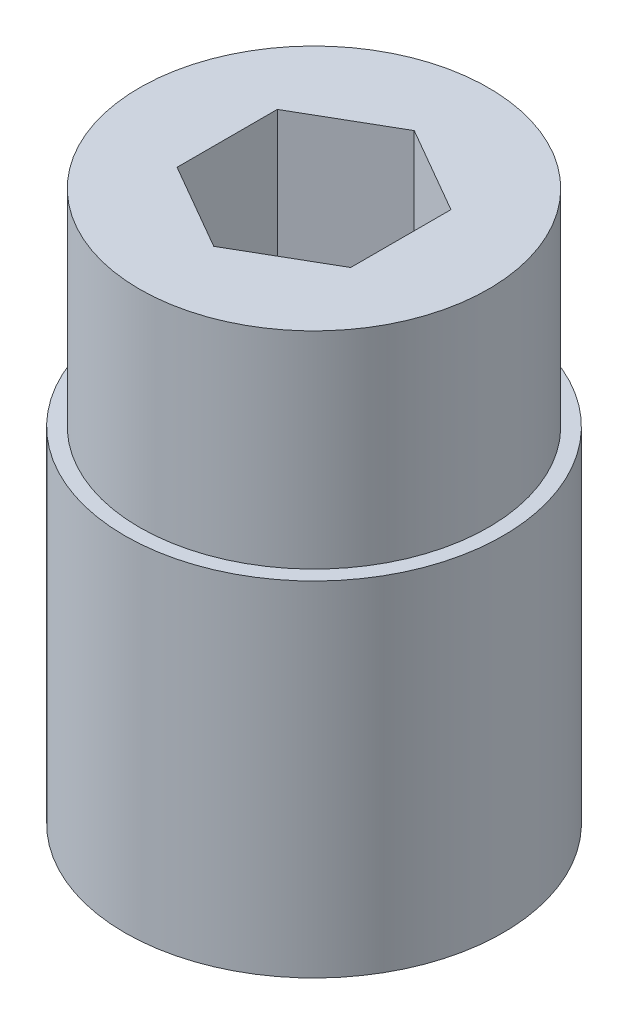
ISO-10303-21;
HEADER;
FILE_DESCRIPTION(('STEP AP214'),'2;1');
FILE_NAME('part.step','',(''),(''),'','','');
FILE_SCHEMA(('AUTOMOTIVE_DESIGN { 1 0 10303 214 1 1 1 1 }'));
ENDSEC;
DATA;
#1=APPLICATION_CONTEXT('core data for automotive mechanical design processes');
#2=APPLICATION_PROTOCOL_DEFINITION('international standard','automotive_design',2000,#1);
#3=PRODUCT_CONTEXT('',#1,'mechanical');
#4=PRODUCT('Part','Part','',(#3));
#5=PRODUCT_RELATED_PRODUCT_CATEGORY('part','',(#4));
#6=PRODUCT_DEFINITION_FORMATION('','',#4);
#7=PRODUCT_DEFINITION_CONTEXT('part definition',#1,'design');
#8=PRODUCT_DEFINITION('design','',#6,#7);
#9=PRODUCT_DEFINITION_SHAPE('','',#8);
#10=(LENGTH_UNIT() NAMED_UNIT(*) SI_UNIT(.MILLI.,.METRE.));
#11=(NAMED_UNIT(*) PLANE_ANGLE_UNIT() SI_UNIT($,.RADIAN.));
#12=(NAMED_UNIT(*) SI_UNIT($,.STERADIAN.) SOLID_ANGLE_UNIT());
#13=UNCERTAINTY_MEASURE_WITH_UNIT(LENGTH_MEASURE(1.E-05),#10,'distance_accuracy_value','');
#14=(GEOMETRIC_REPRESENTATION_CONTEXT(3) GLOBAL_UNCERTAINTY_ASSIGNED_CONTEXT((#13)) GLOBAL_UNIT_ASSIGNED_CONTEXT((#10,
#11,#12)) REPRESENTATION_CONTEXT('',''));
#15=CARTESIAN_POINT('',(0.,0.,0.));
#16=DIRECTION('',(0.,0.,1.));
#17=DIRECTION('',(1.,0.,0.));
#18=AXIS2_PLACEMENT_3D('',#15,#16,#17);
#19=CARTESIAN_POINT('',(0.,10.,0.));
#20=DIRECTION('',(0.,1.,0.));
#21=DIRECTION('',(0.,0.,1.));
#22=AXIS2_PLACEMENT_3D('',#19,#20,#21);
#23=PLANE('',#22);
#24=CARTESIAN_POINT('',(0.,10.,0.));
#25=DIRECTION('',(0.,1.,0.));
#26=DIRECTION('',(0.,0.,1.));
#27=AXIS2_PLACEMENT_3D('',#24,#25,#26);
#28=CIRCLE('',#27,5.075);
#29=CARTESIAN_POINT('',(0.,10.,5.075));
#30=VERTEX_POINT('',#29);
#31=EDGE_CURVE('E12',#30,#30,#28,.T.);
#32=ORIENTED_EDGE('',*,*,#31,.F.);
#33=EDGE_LOOP('',(#32));
#34=FACE_BOUND('',#33,.T.);
#35=CARTESIAN_POINT('',(0.,10.,0.));
#36=DIRECTION('',(0.,1.,0.));
#37=DIRECTION('',(0.,0.,1.));
#38=AXIS2_PLACEMENT_3D('',#35,#36,#37);
#39=CIRCLE('',#38,5.5);
#40=CARTESIAN_POINT('',(0.,10.,5.5));
#41=VERTEX_POINT('',#40);
#42=EDGE_CURVE('E117',#41,#41,#39,.T.);
#43=ORIENTED_EDGE('',*,*,#42,.T.);
#44=EDGE_LOOP('',(#43));
#45=FACE_BOUND('',#44,.T.);
#46=ADVANCED_FACE('F40',(#34,#45),#23,.T.);
#47=CARTESIAN_POINT('',(0.,0.,0.));
#48=DIRECTION('',(0.,1.,0.));
#49=DIRECTION('',(0.,0.,1.));
#50=AXIS2_PLACEMENT_3D('',#47,#48,#49);
#51=PLANE('',#50);
#52=DIRECTION('',(0.866025403784439,0.,-0.5));
#53=VECTOR('',#52,1.);
#54=CARTESIAN_POINT('',(0.,0.,2.91561885940761));
#55=LINE('',#54,#53);
#56=CARTESIAN_POINT('',(0.,0.,2.91561885940761));
#57=VERTEX_POINT('',#56);
#58=CARTESIAN_POINT('',(2.525,0.,1.45780942970381));
#59=VERTEX_POINT('',#58);
#60=EDGE_CURVE('E101',#57,#59,#55,.T.);
#61=ORIENTED_EDGE('',*,*,#60,.T.);
#62=DIRECTION('',(0.,0.,-1.));
#63=VECTOR('',#62,1.);
#64=CARTESIAN_POINT('',(2.525,0.,1.45780942970381));
#65=LINE('',#64,#63);
#66=CARTESIAN_POINT('',(2.525,0.,-1.45780942970381));
#67=VERTEX_POINT('',#66);
#68=EDGE_CURVE('E95',#59,#67,#65,.T.);
#69=ORIENTED_EDGE('',*,*,#68,.T.);
#70=DIRECTION('',(-0.866025403784439,0.,-0.5));
#71=VECTOR('',#70,1.);
#72=CARTESIAN_POINT('',(2.525,0.,-1.45780942970381));
#73=LINE('',#72,#71);
#74=CARTESIAN_POINT('',(0.,0.,-2.91561885940761));
#75=VERTEX_POINT('',#74);
#76=EDGE_CURVE('E104',#67,#75,#73,.T.);
#77=ORIENTED_EDGE('',*,*,#76,.T.);
#78=DIRECTION('',(-0.866025403784439,0.,0.5));
#79=VECTOR('',#78,1.);
#80=CARTESIAN_POINT('',(0.,0.,-2.91561885940761));
#81=LINE('',#80,#79);
#82=CARTESIAN_POINT('',(-2.525,0.,-1.45780942970381));
#83=VERTEX_POINT('',#82);
#84=EDGE_CURVE('E55',#75,#83,#81,.T.);
#85=ORIENTED_EDGE('',*,*,#84,.T.);
#86=DIRECTION('',(0.,0.,1.));
#87=VECTOR('',#86,1.);
#88=CARTESIAN_POINT('',(-2.525,0.,-1.45780942970381));
#89=LINE('',#88,#87);
#90=CARTESIAN_POINT('',(-2.525,0.,1.4578094297038));
#91=VERTEX_POINT('',#90);
#92=EDGE_CURVE('E121',#83,#91,#89,.T.);
#93=ORIENTED_EDGE('',*,*,#92,.T.);
#94=DIRECTION('',(0.866025403784439,0.,0.5));
#95=VECTOR('',#94,1.);
#96=CARTESIAN_POINT('',(-2.525,0.,1.4578094297038));
#97=LINE('',#96,#95);
#98=EDGE_CURVE('E124',#91,#57,#97,.T.);
#99=ORIENTED_EDGE('',*,*,#98,.T.);
#100=EDGE_LOOP('',(#61,#69,#77,#85,#93,#99));
#101=FACE_BOUND('',#100,.T.);
#102=CARTESIAN_POINT('',(0.,0.,0.));
#103=DIRECTION('',(0.,1.,0.));
#104=DIRECTION('',(0.,0.,1.));
#105=AXIS2_PLACEMENT_3D('',#102,#103,#104);
#106=CIRCLE('',#105,5.5);
#107=CARTESIAN_POINT('',(0.,0.,5.5));
#108=VERTEX_POINT('',#107);
#109=EDGE_CURVE('E129',#108,#108,#106,.T.);
#110=ORIENTED_EDGE('',*,*,#109,.F.);
#111=EDGE_LOOP('',(#110));
#112=FACE_BOUND('',#111,.T.);
#113=ADVANCED_FACE('F42',(#101,#112),#51,.F.);
#114=CARTESIAN_POINT('',(0.,16.,0.));
#115=DIRECTION('',(0.,-1.,0.));
#116=DIRECTION('',(0.,0.,-1.));
#117=AXIS2_PLACEMENT_3D('',#114,#115,#116);
#118=CYLINDRICAL_SURFACE('',#117,5.075);
#119=CARTESIAN_POINT('',(0.,16.,0.));
#120=DIRECTION('',(0.,1.,0.));
#121=DIRECTION('',(0.,0.,1.));
#122=AXIS2_PLACEMENT_3D('',#119,#120,#121);
#123=CIRCLE('',#122,5.075);
#124=CARTESIAN_POINT('',(0.,16.,5.075));
#125=VERTEX_POINT('',#124);
#126=EDGE_CURVE('E48',#125,#125,#123,.T.);
#127=ORIENTED_EDGE('',*,*,#126,.F.);
#128=EDGE_LOOP('',(#127));
#129=FACE_BOUND('',#128,.T.);
#130=ORIENTED_EDGE('',*,*,#31,.T.);
#131=EDGE_LOOP('',(#130));
#132=FACE_BOUND('',#131,.T.);
#133=ADVANCED_FACE('F152',(#129,#132),#118,.T.);
#134=CARTESIAN_POINT('',(0.,16.,0.));
#135=DIRECTION('',(0.,1.,0.));
#136=DIRECTION('',(0.,0.,1.));
#137=AXIS2_PLACEMENT_3D('',#134,#135,#136);
#138=PLANE('',#137);
#139=DIRECTION('',(0.,0.,-1.));
#140=VECTOR('',#139,1.);
#141=CARTESIAN_POINT('',(2.525,16.,1.45780942970381));
#142=LINE('',#141,#140);
#143=CARTESIAN_POINT('',(2.525,16.,1.45780942970381));
#144=VERTEX_POINT('',#143);
#145=CARTESIAN_POINT('',(2.525,16.,-1.45780942970381));
#146=VERTEX_POINT('',#145);
#147=EDGE_CURVE('E63',#144,#146,#142,.T.);
#148=ORIENTED_EDGE('',*,*,#147,.F.);
#149=DIRECTION('',(0.866025403784439,0.,-0.5));
#150=VECTOR('',#149,1.);
#151=CARTESIAN_POINT('',(0.,16.,2.91561885940761));
#152=LINE('',#151,#150);
#153=CARTESIAN_POINT('',(0.,16.,2.91561885940761));
#154=VERTEX_POINT('',#153);
#155=EDGE_CURVE('E111',#154,#144,#152,.T.);
#156=ORIENTED_EDGE('',*,*,#155,.F.);
#157=DIRECTION('',(0.866025403784439,0.,0.5));
#158=VECTOR('',#157,1.);
#159=CARTESIAN_POINT('',(-2.525,16.,1.4578094297038));
#160=LINE('',#159,#158);
#161=CARTESIAN_POINT('',(-2.525,16.,1.4578094297038));
#162=VERTEX_POINT('',#161);
#163=EDGE_CURVE('E114',#162,#154,#160,.T.);
#164=ORIENTED_EDGE('',*,*,#163,.F.);
#165=DIRECTION('',(0.,0.,1.));
#166=VECTOR('',#165,1.);
#167=CARTESIAN_POINT('',(-2.525,16.,-1.45780942970381));
#168=LINE('',#167,#166);
#169=CARTESIAN_POINT('',(-2.525,16.,-1.45780942970381));
#170=VERTEX_POINT('',#169);
#171=EDGE_CURVE('E134',#170,#162,#168,.T.);
#172=ORIENTED_EDGE('',*,*,#171,.F.);
#173=DIRECTION('',(-0.866025403784439,0.,0.5));
#174=VECTOR('',#173,1.);
#175=CARTESIAN_POINT('',(0.,16.,-2.91561885940761));
#176=LINE('',#175,#174);
#177=CARTESIAN_POINT('',(0.,16.,-2.91561885940761));
#178=VERTEX_POINT('',#177);
#179=EDGE_CURVE('E131',#178,#170,#176,.T.);
#180=ORIENTED_EDGE('',*,*,#179,.F.);
#181=DIRECTION('',(-0.866025403784439,0.,-0.5));
#182=VECTOR('',#181,1.);
#183=CARTESIAN_POINT('',(2.525,16.,-1.45780942970381));
#184=LINE('',#183,#182);
#185=EDGE_CURVE('E128',#146,#178,#184,.T.);
#186=ORIENTED_EDGE('',*,*,#185,.F.);
#187=EDGE_LOOP('',(#148,#156,#164,#172,#180,#186));
#188=FACE_BOUND('',#187,.T.);
#189=ORIENTED_EDGE('',*,*,#126,.T.);
#190=EDGE_LOOP('',(#189));
#191=FACE_BOUND('',#190,.T.);
#192=ADVANCED_FACE('F150',(#188,#191),#138,.T.);
#193=CARTESIAN_POINT('',(2.525,0.,1.45780942970381));
#194=DIRECTION('',(1.,0.,0.));
#195=DIRECTION('',(0.,0.,-1.));
#196=AXIS2_PLACEMENT_3D('',#193,#194,#195);
#197=PLANE('',#196);
#198=ORIENTED_EDGE('',*,*,#147,.T.);
#199=DIRECTION('',(0.,1.,0.));
#200=VECTOR('',#199,1.);
#201=CARTESIAN_POINT('',(2.525,0.,-1.45780942970381));
#202=LINE('',#201,#200);
#203=EDGE_CURVE('E91',#67,#146,#202,.T.);
#204=ORIENTED_EDGE('',*,*,#203,.F.);
#205=ORIENTED_EDGE('',*,*,#68,.F.);
#206=DIRECTION('',(0.,1.,0.));
#207=VECTOR('',#206,1.);
#208=CARTESIAN_POINT('',(2.525,0.,1.45780942970381));
#209=LINE('',#208,#207);
#210=EDGE_CURVE('E139',#59,#144,#209,.T.);
#211=ORIENTED_EDGE('',*,*,#210,.T.);
#212=EDGE_LOOP('',(#198,#204,#205,#211));
#213=FACE_BOUND('',#212,.T.);
#214=ADVANCED_FACE('F93',(#213),#197,.F.);
#215=CARTESIAN_POINT('',(0.,0.,2.91561885940761));
#216=DIRECTION('',(0.5,0.,0.866025403784439));
#217=DIRECTION('',(0.866025403784439,0.,-0.5));
#218=AXIS2_PLACEMENT_3D('',#215,#216,#217);
#219=PLANE('',#218);
#220=ORIENTED_EDGE('',*,*,#155,.T.);
#221=ORIENTED_EDGE('',*,*,#210,.F.);
#222=ORIENTED_EDGE('',*,*,#60,.F.);
#223=DIRECTION('',(0.,1.,0.));
#224=VECTOR('',#223,1.);
#225=CARTESIAN_POINT('',(0.,0.,2.91561885940761));
#226=LINE('',#225,#224);
#227=EDGE_CURVE('E141',#57,#154,#226,.T.);
#228=ORIENTED_EDGE('',*,*,#227,.T.);
#229=EDGE_LOOP('',(#220,#221,#222,#228));
#230=FACE_BOUND('',#229,.T.);
#231=ADVANCED_FACE('F222',(#230),#219,.F.);
#232=CARTESIAN_POINT('',(-2.525,0.,1.4578094297038));
#233=DIRECTION('',(-0.5,0.,0.866025403784439));
#234=DIRECTION('',(0.866025403784439,0.,0.5));
#235=AXIS2_PLACEMENT_3D('',#232,#233,#234);
#236=PLANE('',#235);
#237=ORIENTED_EDGE('',*,*,#163,.T.);
#238=ORIENTED_EDGE('',*,*,#227,.F.);
#239=ORIENTED_EDGE('',*,*,#98,.F.);
#240=DIRECTION('',(0.,1.,0.));
#241=VECTOR('',#240,1.);
#242=CARTESIAN_POINT('',(-2.525,0.,1.4578094297038));
#243=LINE('',#242,#241);
#244=EDGE_CURVE('E143',#91,#162,#243,.T.);
#245=ORIENTED_EDGE('',*,*,#244,.T.);
#246=EDGE_LOOP('',(#237,#238,#239,#245));
#247=FACE_BOUND('',#246,.T.);
#248=ADVANCED_FACE('F212',(#247),#236,.F.);
#249=CARTESIAN_POINT('',(-2.525,0.,-1.45780942970381));
#250=DIRECTION('',(-1.,0.,0.));
#251=DIRECTION('',(0.,0.,1.));
#252=AXIS2_PLACEMENT_3D('',#249,#250,#251);
#253=PLANE('',#252);
#254=ORIENTED_EDGE('',*,*,#171,.T.);
#255=ORIENTED_EDGE('',*,*,#244,.F.);
#256=ORIENTED_EDGE('',*,*,#92,.F.);
#257=DIRECTION('',(0.,1.,0.));
#258=VECTOR('',#257,1.);
#259=CARTESIAN_POINT('',(-2.525,0.,-1.45780942970381));
#260=LINE('',#259,#258);
#261=EDGE_CURVE('E145',#83,#170,#260,.T.);
#262=ORIENTED_EDGE('',*,*,#261,.T.);
#263=EDGE_LOOP('',(#254,#255,#256,#262));
#264=FACE_BOUND('',#263,.T.);
#265=ADVANCED_FACE('F203',(#264),#253,.F.);
#266=CARTESIAN_POINT('',(0.,0.,-2.91561885940761));
#267=DIRECTION('',(-0.5,0.,-0.866025403784439));
#268=DIRECTION('',(-0.866025403784439,0.,0.5));
#269=AXIS2_PLACEMENT_3D('',#266,#267,#268);
#270=PLANE('',#269);
#271=ORIENTED_EDGE('',*,*,#179,.T.);
#272=ORIENTED_EDGE('',*,*,#261,.F.);
#273=ORIENTED_EDGE('',*,*,#84,.F.);
#274=DIRECTION('',(0.,1.,0.));
#275=VECTOR('',#274,1.);
#276=CARTESIAN_POINT('',(0.,0.,-2.91561885940761));
#277=LINE('',#276,#275);
#278=EDGE_CURVE('E100',#75,#178,#277,.T.);
#279=ORIENTED_EDGE('',*,*,#278,.T.);
#280=EDGE_LOOP('',(#271,#272,#273,#279));
#281=FACE_BOUND('',#280,.T.);
#282=ADVANCED_FACE('F194',(#281),#270,.F.);
#283=CARTESIAN_POINT('',(2.525,0.,-1.45780942970381));
#284=DIRECTION('',(0.5,0.,-0.866025403784439));
#285=DIRECTION('',(-0.866025403784439,0.,-0.5));
#286=AXIS2_PLACEMENT_3D('',#283,#284,#285);
#287=PLANE('',#286);
#288=ORIENTED_EDGE('',*,*,#185,.T.);
#289=ORIENTED_EDGE('',*,*,#278,.F.);
#290=ORIENTED_EDGE('',*,*,#76,.F.);
#291=ORIENTED_EDGE('',*,*,#203,.T.);
#292=EDGE_LOOP('',(#288,#289,#290,#291));
#293=FACE_BOUND('',#292,.T.);
#294=ADVANCED_FACE('F105',(#293),#287,.F.);
#295=CARTESIAN_POINT('',(0.,0.,0.));
#296=DIRECTION('',(0.,1.,0.));
#297=DIRECTION('',(0.,0.,1.));
#298=AXIS2_PLACEMENT_3D('',#295,#296,#297);
#299=CYLINDRICAL_SURFACE('',#298,5.5);
#300=ORIENTED_EDGE('',*,*,#109,.T.);
#301=EDGE_LOOP('',(#300));
#302=FACE_BOUND('',#301,.T.);
#303=ORIENTED_EDGE('',*,*,#42,.F.);
#304=EDGE_LOOP('',(#303));
#305=FACE_BOUND('',#304,.T.);
#306=ADVANCED_FACE('F166',(#302,#305),#299,.T.);
#307=CLOSED_SHELL('',(#46,#113,#133,#192,#214,#231,#248,#265,#282,#294,#306));
#308=MANIFOLD_SOLID_BREP('B2',#307);
#309=ADVANCED_BREP_SHAPE_REPRESENTATION('',(#18,#308),#14);
#310=SHAPE_DEFINITION_REPRESENTATION(#9,#309);
ENDSEC;
END-ISO-10303-21;
